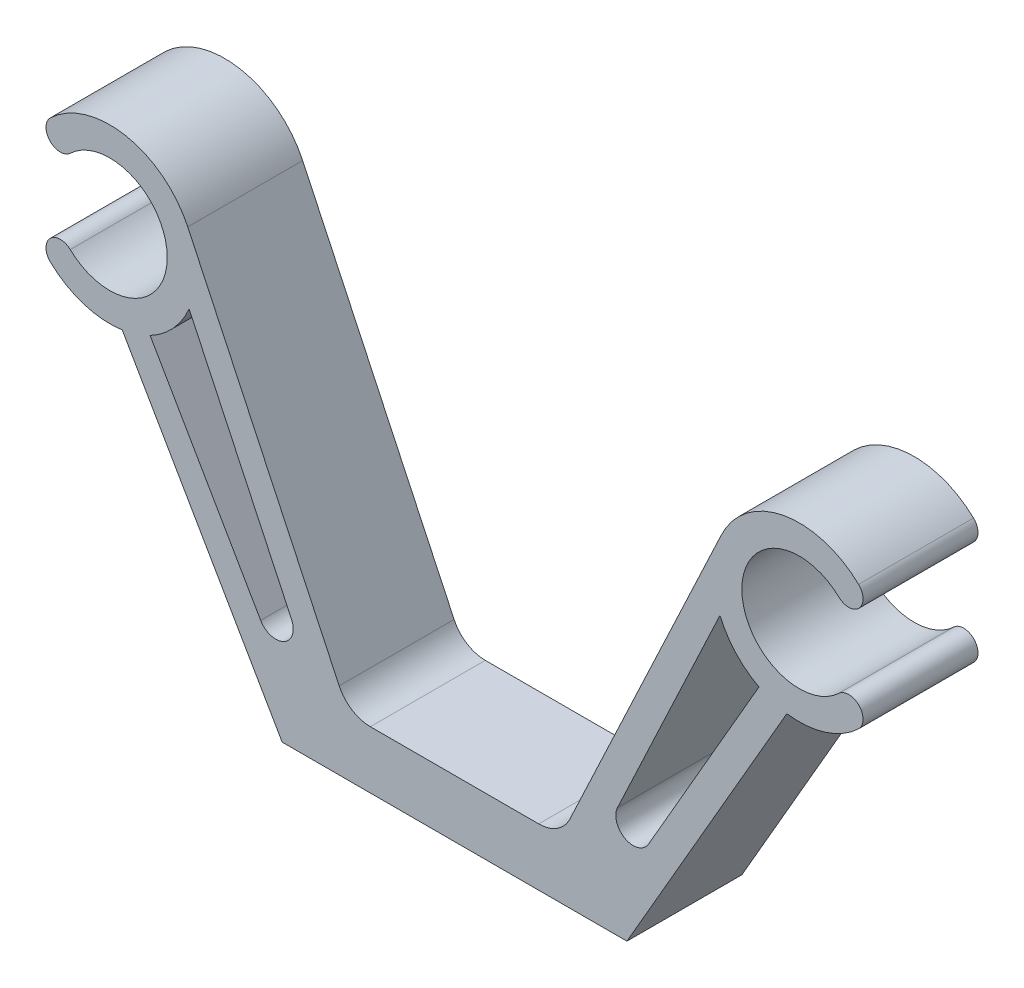
ISO-10303-21;
HEADER;
FILE_DESCRIPTION(('STEP AP214'),'2;1');
FILE_NAME('part.step','',(''),(''),'','','');
FILE_SCHEMA(('AUTOMOTIVE_DESIGN { 1 0 10303 214 1 1 1 1 }'));
ENDSEC;
DATA;
#1=APPLICATION_CONTEXT('core data for automotive mechanical design processes');
#2=APPLICATION_PROTOCOL_DEFINITION('international standard','automotive_design',2000,#1);
#3=PRODUCT_CONTEXT('',#1,'mechanical');
#4=PRODUCT('Part','Part','',(#3));
#5=PRODUCT_RELATED_PRODUCT_CATEGORY('part','',(#4));
#6=PRODUCT_DEFINITION_FORMATION('','',#4);
#7=PRODUCT_DEFINITION_CONTEXT('part definition',#1,'design');
#8=PRODUCT_DEFINITION('design','',#6,#7);
#9=PRODUCT_DEFINITION_SHAPE('','',#8);
#10=(LENGTH_UNIT() NAMED_UNIT(*) SI_UNIT(.MILLI.,.METRE.));
#11=(NAMED_UNIT(*) PLANE_ANGLE_UNIT() SI_UNIT($,.RADIAN.));
#12=(NAMED_UNIT(*) SI_UNIT($,.STERADIAN.) SOLID_ANGLE_UNIT());
#13=UNCERTAINTY_MEASURE_WITH_UNIT(LENGTH_MEASURE(1.E-05),#10,'distance_accuracy_value','');
#14=(GEOMETRIC_REPRESENTATION_CONTEXT(3) GLOBAL_UNCERTAINTY_ASSIGNED_CONTEXT((#13)) GLOBAL_UNIT_ASSIGNED_CONTEXT((#10,
#11,#12)) REPRESENTATION_CONTEXT('',''));
#15=CARTESIAN_POINT('',(0.,0.,0.));
#16=DIRECTION('',(0.,0.,1.));
#17=DIRECTION('',(1.,0.,0.));
#18=AXIS2_PLACEMENT_3D('',#15,#16,#17);
#19=CARTESIAN_POINT('',(-12.5,0.,0.));
#20=DIRECTION('',(0.,1.,0.));
#21=DIRECTION('',(1.,0.,0.));
#22=AXIS2_PLACEMENT_3D('',#19,#20,#21);
#23=CYLINDRICAL_SURFACE('',#22,1.25);
#24=CARTESIAN_POINT('',(-12.5,0.,0.));
#25=DIRECTION('',(0.,1.,0.));
#26=DIRECTION('',(1.,0.,0.));
#27=AXIS2_PLACEMENT_3D('',#24,#25,#26);
#28=CIRCLE('',#27,1.25);
#29=CARTESIAN_POINT('',(-11.25,0.,0.));
#30=VERTEX_POINT('',#29);
#31=CARTESIAN_POINT('',(-13.75,0.,0.));
#32=VERTEX_POINT('',#31);
#33=EDGE_CURVE('E41',#30,#32,#28,.T.);
#34=ORIENTED_EDGE('',*,*,#33,.F.);
#35=CARTESIAN_POINT('',(-12.5,0.,0.));
#36=DIRECTION('',(0.,1.,0.));
#37=DIRECTION('',(1.,0.,0.));
#38=AXIS2_PLACEMENT_3D('',#35,#36,#37);
#39=CIRCLE('',#38,1.25);
#40=EDGE_CURVE('E365',#32,#30,#39,.T.);
#41=ORIENTED_EDGE('',*,*,#40,.F.);
#42=DIRECTION('',(0.,1.,0.));
#43=VECTOR('',#42,1.);
#44=CARTESIAN_POINT('',(-13.75,0.,0.));
#45=LINE('',#44,#43);
#46=CARTESIAN_POINT('',(-13.75,4.5,0.));
#47=VERTEX_POINT('',#46);
#48=EDGE_CURVE('E11',#32,#47,#45,.T.);
#49=ORIENTED_EDGE('',*,*,#48,.T.);
#50=CARTESIAN_POINT('',(-12.5,4.5,0.));
#51=DIRECTION('',(0.,1.,0.));
#52=DIRECTION('',(1.,0.,0.));
#53=AXIS2_PLACEMENT_3D('',#50,#51,#52);
#54=CIRCLE('',#53,1.25);
#55=CARTESIAN_POINT('',(-11.25,4.5,0.));
#56=VERTEX_POINT('',#55);
#57=EDGE_CURVE('E27',#47,#56,#54,.T.);
#58=ORIENTED_EDGE('',*,*,#57,.T.);
#59=CARTESIAN_POINT('',(-12.5,4.5,0.));
#60=DIRECTION('',(0.,1.,0.));
#61=DIRECTION('',(1.,0.,0.));
#62=AXIS2_PLACEMENT_3D('',#59,#60,#61);
#63=CIRCLE('',#62,1.25);
#64=EDGE_CURVE('E323',#56,#47,#63,.T.);
#65=ORIENTED_EDGE('',*,*,#64,.T.);
#66=ORIENTED_EDGE('',*,*,#48,.F.);
#67=EDGE_LOOP('',(#34,#41,#49,#58,#65,#66));
#68=FACE_BOUND('',#67,.T.);
#69=ADVANCED_FACE('F16',(#68),#23,.F.);
#70=CARTESIAN_POINT('',(-12.5,4.5,0.));
#71=DIRECTION('',(0.,-1.,0.));
#72=DIRECTION('',(0.,0.,-1.));
#73=AXIS2_PLACEMENT_3D('',#70,#71,#72);
#74=PLANE('',#73);
#75=ORIENTED_EDGE('',*,*,#64,.F.);
#76=ORIENTED_EDGE('',*,*,#57,.F.);
#77=EDGE_LOOP('',(#75,#76));
#78=FACE_BOUND('',#77,.T.);
#79=ADVANCED_FACE('F632',(#78),#74,.T.);
#80=CARTESIAN_POINT('',(12.5,0.,0.));
#81=DIRECTION('',(0.,1.,0.));
#82=DIRECTION('',(1.,0.,0.));
#83=AXIS2_PLACEMENT_3D('',#80,#81,#82);
#84=CYLINDRICAL_SURFACE('',#83,1.25);
#85=CARTESIAN_POINT('',(12.5,0.,0.));
#86=DIRECTION('',(0.,1.,0.));
#87=DIRECTION('',(1.,0.,0.));
#88=AXIS2_PLACEMENT_3D('',#85,#86,#87);
#89=CIRCLE('',#88,1.25);
#90=CARTESIAN_POINT('',(13.75,0.,0.));
#91=VERTEX_POINT('',#90);
#92=CARTESIAN_POINT('',(11.25,0.,0.));
#93=VERTEX_POINT('',#92);
#94=EDGE_CURVE('E164',#91,#93,#89,.T.);
#95=ORIENTED_EDGE('',*,*,#94,.F.);
#96=CARTESIAN_POINT('',(12.5,0.,0.));
#97=DIRECTION('',(0.,1.,0.));
#98=DIRECTION('',(1.,0.,0.));
#99=AXIS2_PLACEMENT_3D('',#96,#97,#98);
#100=CIRCLE('',#99,1.25);
#101=EDGE_CURVE('E157',#93,#91,#100,.T.);
#102=ORIENTED_EDGE('',*,*,#101,.F.);
#103=DIRECTION('',(0.,1.,0.));
#104=VECTOR('',#103,1.);
#105=CARTESIAN_POINT('',(11.25,0.,0.));
#106=LINE('',#105,#104);
#107=CARTESIAN_POINT('',(11.25,4.5,0.));
#108=VERTEX_POINT('',#107);
#109=EDGE_CURVE('E219',#93,#108,#106,.T.);
#110=ORIENTED_EDGE('',*,*,#109,.T.);
#111=CARTESIAN_POINT('',(12.5,4.5,0.));
#112=DIRECTION('',(0.,1.,0.));
#113=DIRECTION('',(1.,0.,0.));
#114=AXIS2_PLACEMENT_3D('',#111,#112,#113);
#115=CIRCLE('',#114,1.25);
#116=CARTESIAN_POINT('',(13.75,4.5,0.));
#117=VERTEX_POINT('',#116);
#118=EDGE_CURVE('E215',#108,#117,#115,.T.);
#119=ORIENTED_EDGE('',*,*,#118,.T.);
#120=CARTESIAN_POINT('',(12.5,4.5,0.));
#121=DIRECTION('',(0.,1.,0.));
#122=DIRECTION('',(1.,0.,0.));
#123=AXIS2_PLACEMENT_3D('',#120,#121,#122);
#124=CIRCLE('',#123,1.25);
#125=EDGE_CURVE('E220',#117,#108,#124,.T.);
#126=ORIENTED_EDGE('',*,*,#125,.T.);
#127=ORIENTED_EDGE('',*,*,#109,.F.);
#128=EDGE_LOOP('',(#95,#102,#110,#119,#126,#127));
#129=FACE_BOUND('',#128,.T.);
#130=ADVANCED_FACE('F638',(#129),#84,.F.);
#131=CARTESIAN_POINT('',(12.5,4.5,0.));
#132=DIRECTION('',(0.,-1.,0.));
#133=DIRECTION('',(0.,0.,-1.));
#134=AXIS2_PLACEMENT_3D('',#131,#132,#133);
#135=PLANE('',#134);
#136=ORIENTED_EDGE('',*,*,#125,.F.);
#137=ORIENTED_EDGE('',*,*,#118,.F.);
#138=EDGE_LOOP('',(#136,#137));
#139=FACE_BOUND('',#138,.T.);
#140=ADVANCED_FACE('F640',(#139),#135,.T.);
#141=CARTESIAN_POINT('',(0.,19.5124133674503,-5.));
#142=DIRECTION('',(0.,0.,1.));
#143=DIRECTION('',(1.,0.,0.));
#144=AXIS2_PLACEMENT_3D('',#141,#142,#143);
#145=PLANE('',#144);
#146=CARTESIAN_POINT('',(34.2992907802256,36.0611907841218,-5.));
#147=DIRECTION('',(0.,0.,1.));
#148=DIRECTION('',(0.997274035322986,-0.0737868448343487,0.));
#149=AXIS2_PLACEMENT_3D('',#146,#147,#148);
#150=CIRCLE('',#149,1.25);
#151=CARTESIAN_POINT('',(33.4394326241805,35.1539179742776,-5.));
#152=VERTEX_POINT('',#151);
#153=CARTESIAN_POINT('',(35.1591489362707,36.9684635939661,-5.));
#154=VERTEX_POINT('',#153);
#155=EDGE_CURVE('E203',#152,#154,#150,.T.);
#156=ORIENTED_EDGE('',*,*,#155,.F.);
#157=CARTESIAN_POINT('',(30.,31.5248267349006,-5.));
#158=DIRECTION('',(0.,0.,1.));
#159=DIRECTION('',(-1.,0.,0.));
#160=AXIS2_PLACEMENT_3D('',#157,#158,#159);
#161=CIRCLE('',#160,5.);
#162=CARTESIAN_POINT('',(33.4394326241805,27.8957354955235,-5.));
#163=VERTEX_POINT('',#162);
#164=EDGE_CURVE('E412',#152,#163,#161,.T.);
#165=ORIENTED_EDGE('',*,*,#164,.T.);
#166=CARTESIAN_POINT('',(34.2992907802256,26.9884626856793,-5.));
#167=DIRECTION('',(0.,0.,1.));
#168=DIRECTION('',(0.997274035322986,0.0737868448343435,0.));
#169=AXIS2_PLACEMENT_3D('',#166,#167,#168);
#170=CIRCLE('',#169,1.25);
#171=CARTESIAN_POINT('',(35.1591489362707,26.081189875835,-5.));
#172=VERTEX_POINT('',#171);
#173=EDGE_CURVE('E311',#172,#163,#170,.T.);
#174=ORIENTED_EDGE('',*,*,#173,.F.);
#175=CARTESIAN_POINT('',(30.,31.5248267349006,-5.));
#176=DIRECTION('',(0.,0.,-1.));
#177=DIRECTION('',(-0.144507902995128,-0.989503646265111,0.));
#178=AXIS2_PLACEMENT_3D('',#175,#176,#177);
#179=CIRCLE('',#178,7.5);
#180=CARTESIAN_POINT('',(28.9161907275365,24.1035493879122,-5.));
#181=VERTEX_POINT('',#180);
#182=EDGE_CURVE('E173',#172,#181,#179,.T.);
#183=ORIENTED_EDGE('',*,*,#182,.T.);
#184=DIRECTION('',(-0.5,-0.866025403784439,0.));
#185=VECTOR('',#184,1.);
#186=CARTESIAN_POINT('',(15.,0.,-5.));
#187=LINE('',#186,#185);
#188=CARTESIAN_POINT('',(15.,0.,-5.));
#189=VERTEX_POINT('',#188);
#190=EDGE_CURVE('E145',#181,#189,#187,.T.);
#191=ORIENTED_EDGE('',*,*,#190,.T.);
#192=DIRECTION('',(-1.,0.,0.));
#193=VECTOR('',#192,1.);
#194=CARTESIAN_POINT('',(-15.,0.,-5.));
#195=LINE('',#194,#193);
#196=CARTESIAN_POINT('',(-15.,0.,-5.));
#197=VERTEX_POINT('',#196);
#198=EDGE_CURVE('E137',#189,#197,#195,.T.);
#199=ORIENTED_EDGE('',*,*,#198,.T.);
#200=DIRECTION('',(-0.5,0.866025403784439,0.));
#201=VECTOR('',#200,1.);
#202=CARTESIAN_POINT('',(-28.9161907275366,24.1035493879122,-5.));
#203=LINE('',#202,#201);
#204=CARTESIAN_POINT('',(-28.9161907275366,24.1035493879122,-5.));
#205=VERTEX_POINT('',#204);
#206=EDGE_CURVE('E126',#197,#205,#203,.T.);
#207=ORIENTED_EDGE('',*,*,#206,.T.);
#208=CARTESIAN_POINT('',(-30.,31.5248267349006,-5.));
#209=DIRECTION('',(0.,0.,-1.));
#210=DIRECTION('',(0.904791980801381,0.425853814680007,0.));
#211=AXIS2_PLACEMENT_3D('',#208,#209,#210);
#212=CIRCLE('',#211,7.5);
#213=CARTESIAN_POINT('',(-35.1591489362707,26.081189875835,-5.));
#214=VERTEX_POINT('',#213);
#215=EDGE_CURVE('E138',#205,#214,#212,.T.);
#216=ORIENTED_EDGE('',*,*,#215,.T.);
#217=CARTESIAN_POINT('',(-34.2992907802256,26.9884626856793,-5.));
#218=DIRECTION('',(0.,0.,1.));
#219=DIRECTION('',(-0.997274035322986,0.0737868448343487,0.));
#220=AXIS2_PLACEMENT_3D('',#217,#218,#219);
#221=CIRCLE('',#220,1.25);
#222=CARTESIAN_POINT('',(-33.4394326241805,27.8957354955235,-5.));
#223=VERTEX_POINT('',#222);
#224=EDGE_CURVE('E368',#223,#214,#221,.T.);
#225=ORIENTED_EDGE('',*,*,#224,.F.);
#226=CARTESIAN_POINT('',(-30.,31.5248267349006,-5.));
#227=DIRECTION('',(0.,0.,1.));
#228=DIRECTION('',(-1.,0.,0.));
#229=AXIS2_PLACEMENT_3D('',#226,#227,#228);
#230=CIRCLE('',#229,5.);
#231=CARTESIAN_POINT('',(-33.4394326241805,35.1539179742776,-5.));
#232=VERTEX_POINT('',#231);
#233=EDGE_CURVE('E294',#223,#232,#230,.T.);
#234=ORIENTED_EDGE('',*,*,#233,.T.);
#235=CARTESIAN_POINT('',(-34.2992907802256,36.0611907841218,-5.));
#236=DIRECTION('',(0.,0.,1.));
#237=DIRECTION('',(-0.997274035322986,-0.0737868448343487,0.));
#238=AXIS2_PLACEMENT_3D('',#235,#236,#237);
#239=CIRCLE('',#238,1.25);
#240=CARTESIAN_POINT('',(-35.1591489362707,36.9684635939661,-5.));
#241=VERTEX_POINT('',#240);
#242=EDGE_CURVE('E209',#241,#232,#239,.T.);
#243=ORIENTED_EDGE('',*,*,#242,.F.);
#244=CARTESIAN_POINT('',(-30.,31.5248267349006,-5.));
#245=DIRECTION('',(0.,0.,-1.));
#246=DIRECTION('',(0.904791980801381,0.425853814680007,0.));
#247=AXIS2_PLACEMENT_3D('',#244,#245,#246);
#248=CIRCLE('',#247,7.5);
#249=CARTESIAN_POINT('',(-23.2140601439896,34.7187303450006,-5.));
#250=VERTEX_POINT('',#249);
#251=EDGE_CURVE('E298',#241,#250,#248,.T.);
#252=ORIENTED_EDGE('',*,*,#251,.T.);
#253=DIRECTION('',(0.425853814680007,-0.904791980801381,0.));
#254=VECTOR('',#253,1.);
#255=CARTESIAN_POINT('',(-9.22649730810374,5.,-5.));
#256=LINE('',#255,#254);
#257=CARTESIAN_POINT('',(-10.0371886550339,6.72243855595998,-5.));
#258=VERTEX_POINT('',#257);
#259=EDGE_CURVE('E302',#250,#258,#256,.T.);
#260=ORIENTED_EDGE('',*,*,#259,.T.);
#261=CARTESIAN_POINT('',(-7.32281271262976,8.,-5.));
#262=DIRECTION('',(0.,0.,-1.));
#263=DIRECTION('',(-0.535792023699492,-0.844349991022682,0.));
#264=AXIS2_PLACEMENT_3D('',#261,#262,#263);
#265=CIRCLE('',#264,3.);
#266=CARTESIAN_POINT('',(-7.32281271262976,5.,-5.));
#267=VERTEX_POINT('',#266);
#268=EDGE_CURVE('E268',#267,#258,#265,.T.);
#269=ORIENTED_EDGE('',*,*,#268,.F.);
#270=DIRECTION('',(1.,0.,0.));
#271=VECTOR('',#270,1.);
#272=CARTESIAN_POINT('',(9.22649730810374,5.,-5.));
#273=LINE('',#272,#271);
#274=CARTESIAN_POINT('',(7.32281271262976,5.,-5.));
#275=VERTEX_POINT('',#274);
#276=EDGE_CURVE('E293',#267,#275,#273,.T.);
#277=ORIENTED_EDGE('',*,*,#276,.T.);
#278=CARTESIAN_POINT('',(7.32281271262976,8.,-5.));
#279=DIRECTION('',(0.,0.,-1.));
#280=DIRECTION('',(0.535792023699491,-0.844349991022682,0.));
#281=AXIS2_PLACEMENT_3D('',#278,#279,#280);
#282=CIRCLE('',#281,3.);
#283=CARTESIAN_POINT('',(10.0371886550339,6.72243855595998,-5.));
#284=VERTEX_POINT('',#283);
#285=EDGE_CURVE('E190',#284,#275,#282,.T.);
#286=ORIENTED_EDGE('',*,*,#285,.F.);
#287=DIRECTION('',(0.425853814680007,0.904791980801381,0.));
#288=VECTOR('',#287,1.);
#289=CARTESIAN_POINT('',(23.2140601439896,34.7187303450006,-5.));
#290=LINE('',#289,#288);
#291=CARTESIAN_POINT('',(23.2140601439896,34.7187303450006,-5.));
#292=VERTEX_POINT('',#291);
#293=EDGE_CURVE('E289',#284,#292,#290,.T.);
#294=ORIENTED_EDGE('',*,*,#293,.T.);
#295=CARTESIAN_POINT('',(30.,31.5248267349006,-5.));
#296=DIRECTION('',(0.,0.,-1.));
#297=DIRECTION('',(-0.144507902995128,-0.989503646265111,0.));
#298=AXIS2_PLACEMENT_3D('',#295,#296,#297);
#299=CIRCLE('',#298,7.5);
#300=EDGE_CURVE('E225',#292,#154,#299,.T.);
#301=ORIENTED_EDGE('',*,*,#300,.T.);
#302=EDGE_LOOP('',(#156,#165,#174,#183,#191,#199,#207,#216,#225,#234,#243,#252,#260,#269,#277,
#286,#294,#301));
#303=FACE_BOUND('',#302,.T.);
#304=DIRECTION('',(0.5,0.866025403784439,0.));
#305=VECTOR('',#304,1.);
#306=CARTESIAN_POINT('',(17.2022036638368,8.81432863437965,-5.));
#307=LINE('',#306,#305);
#308=CARTESIAN_POINT('',(16.8703480044572,8.23953777155488,-5.));
#309=VERTEX_POINT('',#308);
#310=CARTESIAN_POINT('',(26.4880544227988,24.8978939404038,-5.));
#311=VERTEX_POINT('',#310);
#312=EDGE_CURVE('E221',#309,#311,#307,.T.);
#313=ORIENTED_EDGE('',*,*,#312,.T.);
#314=CARTESIAN_POINT('',(30.,31.5248267349006,-5.));
#315=DIRECTION('',(0.,0.,-1.));
#316=DIRECTION('',(0.468259410293499,0.883591039266235,0.));
#317=AXIS2_PLACEMENT_3D('',#314,#315,#316);
#318=CIRCLE('',#317,7.5);
#319=CARTESIAN_POINT('',(23.0954449007379,28.5961548718792,-5.));
#320=VERTEX_POINT('',#319);
#321=EDGE_CURVE('E226',#311,#320,#318,.T.);
#322=ORIENTED_EDGE('',*,*,#321,.T.);
#323=DIRECTION('',(-0.425853814680007,-0.904791980801381,0.));
#324=VECTOR('',#323,1.);
#325=CARTESIAN_POINT('',(19.2512242352833,20.4285163287142,-5.));
#326=LINE('',#325,#324);
#327=CARTESIAN_POINT('',(14.1770685355542,9.64769148180683,-5.));
#328=VERTEX_POINT('',#327);
#329=EDGE_CURVE('E195',#320,#328,#326,.T.);
#330=ORIENTED_EDGE('',*,*,#329,.T.);
#331=CARTESIAN_POINT('',(15.5531887875532,9.,-5.));
#332=DIRECTION('',(0.,0.,1.));
#333=DIRECTION('',(0.866025403784439,-0.5,0.));
#334=AXIS2_PLACEMENT_3D('',#331,#332,#333);
#335=CIRCLE('',#334,1.52092445689024);
#336=EDGE_CURVE('E191',#328,#309,#335,.T.);
#337=ORIENTED_EDGE('',*,*,#336,.T.);
#338=EDGE_LOOP('',(#313,#322,#330,#337));
#339=FACE_BOUND('',#338,.T.);
#340=DIRECTION('',(-0.425853814680007,0.904791980801381,0.));
#341=VECTOR('',#340,1.);
#342=CARTESIAN_POINT('',(-19.2512242352833,20.4285163287142,-5.));
#343=LINE('',#342,#341);
#344=CARTESIAN_POINT('',(-14.1770685355542,9.64769148180683,-5.));
#345=VERTEX_POINT('',#344);
#346=CARTESIAN_POINT('',(-23.0954449007379,28.5961548718792,-5.));
#347=VERTEX_POINT('',#346);
#348=EDGE_CURVE('E196',#345,#347,#343,.T.);
#349=ORIENTED_EDGE('',*,*,#348,.T.);
#350=CARTESIAN_POINT('',(-30.,31.5248267349006,-5.));
#351=DIRECTION('',(0.,0.,-1.));
#352=DIRECTION('',(-0.468259410293499,0.883591039266235,0.));
#353=AXIS2_PLACEMENT_3D('',#350,#351,#352);
#354=CIRCLE('',#353,7.5);
#355=CARTESIAN_POINT('',(-26.4880544227988,24.8978939404038,-5.));
#356=VERTEX_POINT('',#355);
#357=EDGE_CURVE('E230',#347,#356,#354,.T.);
#358=ORIENTED_EDGE('',*,*,#357,.T.);
#359=DIRECTION('',(0.5,-0.866025403784439,0.));
#360=VECTOR('',#359,1.);
#361=CARTESIAN_POINT('',(-17.2022036638368,8.81432863437965,-5.));
#362=LINE('',#361,#360);
#363=CARTESIAN_POINT('',(-16.8703480044572,8.23953777155488,-5.));
#364=VERTEX_POINT('',#363);
#365=EDGE_CURVE('E243',#356,#364,#362,.T.);
#366=ORIENTED_EDGE('',*,*,#365,.T.);
#367=CARTESIAN_POINT('',(-15.5531887875532,9.,-5.));
#368=DIRECTION('',(0.,0.,1.));
#369=DIRECTION('',(-0.866025403784439,-0.5,0.));
#370=AXIS2_PLACEMENT_3D('',#367,#368,#369);
#371=CIRCLE('',#370,1.52092445689024);
#372=EDGE_CURVE('E281',#364,#345,#371,.T.);
#373=ORIENTED_EDGE('',*,*,#372,.T.);
#374=EDGE_LOOP('',(#349,#358,#366,#373));
#375=FACE_BOUND('',#374,.T.);
#376=ADVANCED_FACE('F141',(#303,#339,#375),#145,.F.);
#377=CARTESIAN_POINT('',(34.2992907802256,36.0611907841218,0.));
#378=DIRECTION('',(0.,0.,1.));
#379=DIRECTION('',(-0.0737868448343482,-0.997274035322986,0.));
#380=AXIS2_PLACEMENT_3D('',#377,#378,#379);
#381=CYLINDRICAL_SURFACE('',#380,1.25);
#382=CARTESIAN_POINT('',(34.2992907802256,36.0611907841218,5.));
#383=DIRECTION('',(0.,0.,-1.));
#384=DIRECTION('',(0.997274035322986,-0.0737868448343487,0.));
#385=AXIS2_PLACEMENT_3D('',#382,#383,#384);
#386=CIRCLE('',#385,1.25);
#387=CARTESIAN_POINT('',(35.1591489362707,36.9684635939661,5.));
#388=VERTEX_POINT('',#387);
#389=CARTESIAN_POINT('',(33.4394326241805,35.1539179742776,5.));
#390=VERTEX_POINT('',#389);
#391=EDGE_CURVE('E285',#388,#390,#386,.T.);
#392=ORIENTED_EDGE('',*,*,#391,.T.);
#393=DIRECTION('',(0.,0.,-1.));
#394=VECTOR('',#393,1.);
#395=CARTESIAN_POINT('',(33.4394326241805,35.1539179742776,0.));
#396=LINE('',#395,#394);
#397=EDGE_CURVE('E207',#390,#152,#396,.T.);
#398=ORIENTED_EDGE('',*,*,#397,.T.);
#399=ORIENTED_EDGE('',*,*,#155,.T.);
#400=DIRECTION('',(0.,0.,1.));
#401=VECTOR('',#400,1.);
#402=CARTESIAN_POINT('',(35.1591489362707,36.9684635939661,0.));
#403=LINE('',#402,#401);
#404=EDGE_CURVE('E208',#154,#388,#403,.T.);
#405=ORIENTED_EDGE('',*,*,#404,.T.);
#406=EDGE_LOOP('',(#392,#398,#399,#405));
#407=FACE_BOUND('',#406,.T.);
#408=ADVANCED_FACE('F648',(#407),#381,.T.);
#409=CARTESIAN_POINT('',(30.,31.5248267349006,0.));
#410=DIRECTION('',(0.,0.,1.));
#411=DIRECTION('',(-1.,0.,0.));
#412=AXIS2_PLACEMENT_3D('',#409,#410,#411);
#413=CYLINDRICAL_SURFACE('',#412,5.);
#414=ORIENTED_EDGE('',*,*,#397,.F.);
#415=CARTESIAN_POINT('',(30.,31.5248267349006,5.));
#416=DIRECTION('',(0.,0.,-1.));
#417=DIRECTION('',(-1.,0.,0.));
#418=AXIS2_PLACEMENT_3D('',#415,#416,#417);
#419=CIRCLE('',#418,5.);
#420=CARTESIAN_POINT('',(33.4394326241805,27.8957354955235,5.));
#421=VERTEX_POINT('',#420);
#422=EDGE_CURVE('E179',#421,#390,#419,.T.);
#423=ORIENTED_EDGE('',*,*,#422,.F.);
#424=DIRECTION('',(0.,0.,1.));
#425=VECTOR('',#424,1.);
#426=CARTESIAN_POINT('',(33.4394326241805,27.8957354955235,0.));
#427=LINE('',#426,#425);
#428=EDGE_CURVE('E316',#163,#421,#427,.T.);
#429=ORIENTED_EDGE('',*,*,#428,.F.);
#430=ORIENTED_EDGE('',*,*,#164,.F.);
#431=EDGE_LOOP('',(#414,#423,#429,#430));
#432=FACE_BOUND('',#431,.T.);
#433=ADVANCED_FACE('F666',(#432),#413,.F.);
#434=CARTESIAN_POINT('',(0.,19.5124133674503,5.));
#435=DIRECTION('',(0.,0.,1.));
#436=DIRECTION('',(1.,0.,0.));
#437=AXIS2_PLACEMENT_3D('',#434,#435,#436);
#438=PLANE('',#437);
#439=ORIENTED_EDGE('',*,*,#391,.F.);
#440=CARTESIAN_POINT('',(30.,31.5248267349006,5.));
#441=DIRECTION('',(0.,0.,1.));
#442=DIRECTION('',(-0.144507902995128,-0.989503646265111,0.));
#443=AXIS2_PLACEMENT_3D('',#440,#441,#442);
#444=CIRCLE('',#443,7.5);
#445=CARTESIAN_POINT('',(23.2140601439896,34.7187303450006,5.));
#446=VERTEX_POINT('',#445);
#447=EDGE_CURVE('E201',#388,#446,#444,.T.);
#448=ORIENTED_EDGE('',*,*,#447,.T.);
#449=DIRECTION('',(-0.425853814680007,-0.904791980801381,0.));
#450=VECTOR('',#449,1.);
#451=CARTESIAN_POINT('',(23.2140601439896,34.7187303450006,5.));
#452=LINE('',#451,#450);
#453=CARTESIAN_POINT('',(10.0371886550339,6.72243855595998,5.));
#454=VERTEX_POINT('',#453);
#455=EDGE_CURVE('E197',#446,#454,#452,.T.);
#456=ORIENTED_EDGE('',*,*,#455,.T.);
#457=CARTESIAN_POINT('',(7.32281271262976,8.,5.));
#458=DIRECTION('',(0.,0.,1.));
#459=DIRECTION('',(0.535792023699491,-0.844349991022682,0.));
#460=AXIS2_PLACEMENT_3D('',#457,#458,#459);
#461=CIRCLE('',#460,3.);
#462=CARTESIAN_POINT('',(7.32281271262976,5.,5.));
#463=VERTEX_POINT('',#462);
#464=EDGE_CURVE('E267',#463,#454,#461,.T.);
#465=ORIENTED_EDGE('',*,*,#464,.F.);
#466=DIRECTION('',(-1.,0.,0.));
#467=VECTOR('',#466,1.);
#468=CARTESIAN_POINT('',(9.22649730810374,5.,5.));
#469=LINE('',#468,#467);
#470=CARTESIAN_POINT('',(-7.32281271262976,5.,5.));
#471=VERTEX_POINT('',#470);
#472=EDGE_CURVE('E202',#463,#471,#469,.T.);
#473=ORIENTED_EDGE('',*,*,#472,.T.);
#474=CARTESIAN_POINT('',(-7.32281271262976,8.,5.));
#475=DIRECTION('',(0.,0.,1.));
#476=DIRECTION('',(-0.535792023699492,-0.844349991022682,0.));
#477=AXIS2_PLACEMENT_3D('',#474,#475,#476);
#478=CIRCLE('',#477,3.);
#479=CARTESIAN_POINT('',(-10.0371886550339,6.72243855595998,5.));
#480=VERTEX_POINT('',#479);
#481=EDGE_CURVE('E359',#480,#471,#478,.T.);
#482=ORIENTED_EDGE('',*,*,#481,.F.);
#483=DIRECTION('',(-0.425853814680007,0.904791980801381,0.));
#484=VECTOR('',#483,1.);
#485=CARTESIAN_POINT('',(-9.22649730810374,5.,5.));
#486=LINE('',#485,#484);
#487=CARTESIAN_POINT('',(-23.2140601439896,34.7187303450006,5.));
#488=VERTEX_POINT('',#487);
#489=EDGE_CURVE('E231',#480,#488,#486,.T.);
#490=ORIENTED_EDGE('',*,*,#489,.T.);
#491=CARTESIAN_POINT('',(-30.,31.5248267349006,5.));
#492=DIRECTION('',(0.,0.,1.));
#493=DIRECTION('',(0.904791980801381,0.425853814680007,0.));
#494=AXIS2_PLACEMENT_3D('',#491,#492,#493);
#495=CIRCLE('',#494,7.5);
#496=CARTESIAN_POINT('',(-35.1591489362707,36.9684635939661,5.));
#497=VERTEX_POINT('',#496);
#498=EDGE_CURVE('E235',#488,#497,#495,.T.);
#499=ORIENTED_EDGE('',*,*,#498,.T.);
#500=CARTESIAN_POINT('',(-34.2992907802256,36.0611907841218,5.));
#501=DIRECTION('',(0.,0.,-1.));
#502=DIRECTION('',(0.0737868448343482,-0.997274035322986,0.));
#503=AXIS2_PLACEMENT_3D('',#500,#501,#502);
#504=CIRCLE('',#503,1.25);
#505=CARTESIAN_POINT('',(-33.4394326241805,35.1539179742776,5.));
#506=VERTEX_POINT('',#505);
#507=EDGE_CURVE('E246',#506,#497,#504,.T.);
#508=ORIENTED_EDGE('',*,*,#507,.F.);
#509=CARTESIAN_POINT('',(-30.,31.5248267349006,5.));
#510=DIRECTION('',(0.,0.,-1.));
#511=DIRECTION('',(-1.,0.,0.));
#512=AXIS2_PLACEMENT_3D('',#509,#510,#511);
#513=CIRCLE('',#512,5.);
#514=CARTESIAN_POINT('',(-33.4394326241805,27.8957354955235,5.));
#515=VERTEX_POINT('',#514);
#516=EDGE_CURVE('E402',#506,#515,#513,.T.);
#517=ORIENTED_EDGE('',*,*,#516,.T.);
#518=CARTESIAN_POINT('',(-34.2992907802256,26.9884626856793,5.));
#519=DIRECTION('',(0.,0.,-1.));
#520=DIRECTION('',(-0.997274035322986,0.0737868448343487,0.));
#521=AXIS2_PLACEMENT_3D('',#518,#519,#520);
#522=CIRCLE('',#521,1.25);
#523=CARTESIAN_POINT('',(-35.1591489362707,26.081189875835,5.));
#524=VERTEX_POINT('',#523);
#525=EDGE_CURVE('E379',#524,#515,#522,.T.);
#526=ORIENTED_EDGE('',*,*,#525,.F.);
#527=CARTESIAN_POINT('',(-30.,31.5248267349006,5.));
#528=DIRECTION('',(0.,0.,1.));
#529=DIRECTION('',(0.904791980801381,0.425853814680007,0.));
#530=AXIS2_PLACEMENT_3D('',#527,#528,#529);
#531=CIRCLE('',#530,7.5);
#532=CARTESIAN_POINT('',(-28.9161907275366,24.1035493879122,5.));
#533=VERTEX_POINT('',#532);
#534=EDGE_CURVE('E339',#524,#533,#531,.T.);
#535=ORIENTED_EDGE('',*,*,#534,.T.);
#536=DIRECTION('',(0.5,-0.866025403784439,0.));
#537=VECTOR('',#536,1.);
#538=CARTESIAN_POINT('',(-28.9161907275366,24.1035493879122,5.));
#539=LINE('',#538,#537);
#540=CARTESIAN_POINT('',(-15.,0.,5.));
#541=VERTEX_POINT('',#540);
#542=EDGE_CURVE('E280',#533,#541,#539,.T.);
#543=ORIENTED_EDGE('',*,*,#542,.T.);
#544=DIRECTION('',(1.,0.,0.));
#545=VECTOR('',#544,1.);
#546=CARTESIAN_POINT('',(-15.,0.,5.));
#547=LINE('',#546,#545);
#548=CARTESIAN_POINT('',(15.,0.,5.));
#549=VERTEX_POINT('',#548);
#550=EDGE_CURVE('E154',#541,#549,#547,.T.);
#551=ORIENTED_EDGE('',*,*,#550,.T.);
#552=DIRECTION('',(0.5,0.866025403784439,0.));
#553=VECTOR('',#552,1.);
#554=CARTESIAN_POINT('',(15.,0.,5.));
#555=LINE('',#554,#553);
#556=CARTESIAN_POINT('',(28.9161907275365,24.1035493879122,5.));
#557=VERTEX_POINT('',#556);
#558=EDGE_CURVE('E178',#549,#557,#555,.T.);
#559=ORIENTED_EDGE('',*,*,#558,.T.);
#560=CARTESIAN_POINT('',(30.,31.5248267349006,5.));
#561=DIRECTION('',(0.,0.,1.));
#562=DIRECTION('',(-0.144507902995128,-0.989503646265111,0.));
#563=AXIS2_PLACEMENT_3D('',#560,#561,#562);
#564=CIRCLE('',#563,7.5);
#565=CARTESIAN_POINT('',(35.1591489362707,26.081189875835,5.));
#566=VERTEX_POINT('',#565);
#567=EDGE_CURVE('E174',#557,#566,#564,.T.);
#568=ORIENTED_EDGE('',*,*,#567,.T.);
#569=CARTESIAN_POINT('',(34.2992907802256,26.9884626856793,5.));
#570=DIRECTION('',(0.,0.,-1.));
#571=DIRECTION('',(-0.0737868448343482,0.997274035322986,0.));
#572=AXIS2_PLACEMENT_3D('',#569,#570,#571);
#573=CIRCLE('',#572,1.25);
#574=EDGE_CURVE('E256',#421,#566,#573,.T.);
#575=ORIENTED_EDGE('',*,*,#574,.F.);
#576=ORIENTED_EDGE('',*,*,#422,.T.);
#577=EDGE_LOOP('',(#439,#448,#456,#465,#473,#482,#490,#499,#508,#517,#526,#535,#543,#551,#559,
#568,#575,#576));
#578=FACE_BOUND('',#577,.T.);
#579=DIRECTION('',(0.425853814680007,-0.904791980801381,0.));
#580=VECTOR('',#579,1.);
#581=CARTESIAN_POINT('',(-19.2512242352833,20.4285163287142,5.));
#582=LINE('',#581,#580);
#583=CARTESIAN_POINT('',(-23.0954449007379,28.5961548718792,5.));
#584=VERTEX_POINT('',#583);
#585=CARTESIAN_POINT('',(-14.1770685355542,9.64769148180683,5.));
#586=VERTEX_POINT('',#585);
#587=EDGE_CURVE('E184',#584,#586,#582,.T.);
#588=ORIENTED_EDGE('',*,*,#587,.T.);
#589=CARTESIAN_POINT('',(-15.5531887875532,9.,5.));
#590=DIRECTION('',(0.,0.,-1.));
#591=DIRECTION('',(-0.866025403784439,-0.5,0.));
#592=AXIS2_PLACEMENT_3D('',#589,#590,#591);
#593=CIRCLE('',#592,1.52092445689024);
#594=CARTESIAN_POINT('',(-16.8703480044572,8.23953777155488,5.));
#595=VERTEX_POINT('',#594);
#596=EDGE_CURVE('E180',#586,#595,#593,.T.);
#597=ORIENTED_EDGE('',*,*,#596,.T.);
#598=DIRECTION('',(-0.5,0.866025403784439,0.));
#599=VECTOR('',#598,1.);
#600=CARTESIAN_POINT('',(-17.2022036638368,8.81432863437965,5.));
#601=LINE('',#600,#599);
#602=CARTESIAN_POINT('',(-26.4880544227988,24.8978939404038,5.));
#603=VERTEX_POINT('',#602);
#604=EDGE_CURVE('E20',#595,#603,#601,.T.);
#605=ORIENTED_EDGE('',*,*,#604,.T.);
#606=CARTESIAN_POINT('',(-30.,31.5248267349006,5.));
#607=DIRECTION('',(0.,0.,1.));
#608=DIRECTION('',(-0.468259410293499,0.883591039266235,0.));
#609=AXIS2_PLACEMENT_3D('',#606,#607,#608);
#610=CIRCLE('',#609,7.5);
#611=EDGE_CURVE('E307',#603,#584,#610,.T.);
#612=ORIENTED_EDGE('',*,*,#611,.T.);
#613=EDGE_LOOP('',(#588,#597,#605,#612));
#614=FACE_BOUND('',#613,.T.);
#615=DIRECTION('',(-0.5,-0.866025403784439,0.));
#616=VECTOR('',#615,1.);
#617=CARTESIAN_POINT('',(17.2022036638368,8.81432863437965,5.));
#618=LINE('',#617,#616);
#619=CARTESIAN_POINT('',(26.4880544227988,24.8978939404038,5.));
#620=VERTEX_POINT('',#619);
#621=CARTESIAN_POINT('',(16.8703480044572,8.23953777155488,5.));
#622=VERTEX_POINT('',#621);
#623=EDGE_CURVE('E303',#620,#622,#618,.T.);
#624=ORIENTED_EDGE('',*,*,#623,.T.);
#625=CARTESIAN_POINT('',(15.5531887875532,9.,5.));
#626=DIRECTION('',(0.,0.,-1.));
#627=DIRECTION('',(0.866025403784439,-0.5,0.));
#628=AXIS2_PLACEMENT_3D('',#625,#626,#627);
#629=CIRCLE('',#628,1.52092445689024);
#630=CARTESIAN_POINT('',(14.1770685355542,9.64769148180683,5.));
#631=VERTEX_POINT('',#630);
#632=EDGE_CURVE('E308',#622,#631,#629,.T.);
#633=ORIENTED_EDGE('',*,*,#632,.T.);
#634=DIRECTION('',(0.425853814680007,0.904791980801381,0.));
#635=VECTOR('',#634,1.);
#636=CARTESIAN_POINT('',(19.2512242352833,20.4285163287142,5.));
#637=LINE('',#636,#635);
#638=CARTESIAN_POINT('',(23.0954449007379,28.5961548718792,5.));
#639=VERTEX_POINT('',#638);
#640=EDGE_CURVE('E170',#631,#639,#637,.T.);
#641=ORIENTED_EDGE('',*,*,#640,.T.);
#642=CARTESIAN_POINT('',(30.,31.5248267349006,5.));
#643=DIRECTION('',(0.,0.,1.));
#644=DIRECTION('',(0.468259410293499,0.883591039266235,0.));
#645=AXIS2_PLACEMENT_3D('',#642,#643,#644);
#646=CIRCLE('',#645,7.5);
#647=EDGE_CURVE('E315',#639,#620,#646,.T.);
#648=ORIENTED_EDGE('',*,*,#647,.T.);
#649=EDGE_LOOP('',(#624,#633,#641,#648));
#650=FACE_BOUND('',#649,.T.);
#651=ADVANCED_FACE('F489',(#578,#614,#650),#438,.T.);
#652=CARTESIAN_POINT('',(34.2992907802256,26.9884626856793,0.));
#653=DIRECTION('',(0.,0.,-1.));
#654=DIRECTION('',(-0.0737868448343482,0.997274035322986,0.));
#655=AXIS2_PLACEMENT_3D('',#652,#653,#654);
#656=CYLINDRICAL_SURFACE('',#655,1.25);
#657=ORIENTED_EDGE('',*,*,#173,.T.);
#658=ORIENTED_EDGE('',*,*,#428,.T.);
#659=ORIENTED_EDGE('',*,*,#574,.T.);
#660=DIRECTION('',(0.,0.,-1.));
#661=VECTOR('',#660,1.);
#662=CARTESIAN_POINT('',(35.1591489362707,26.081189875835,0.));
#663=LINE('',#662,#661);
#664=EDGE_CURVE('E239',#566,#172,#663,.T.);
#665=ORIENTED_EDGE('',*,*,#664,.T.);
#666=EDGE_LOOP('',(#657,#658,#659,#665));
#667=FACE_BOUND('',#666,.T.);
#668=ADVANCED_FACE('F665',(#667),#656,.T.);
#669=CARTESIAN_POINT('',(30.,31.5248267349006,0.));
#670=DIRECTION('',(0.,0.,1.));
#671=DIRECTION('',(-0.185085546443899,0.982722412737983,0.));
#672=AXIS2_PLACEMENT_3D('',#669,#670,#671);
#673=CYLINDRICAL_SURFACE('',#672,7.5);
#674=ORIENTED_EDGE('',*,*,#404,.F.);
#675=ORIENTED_EDGE('',*,*,#300,.F.);
#676=DIRECTION('',(0.,0.,1.));
#677=VECTOR('',#676,1.);
#678=CARTESIAN_POINT('',(23.2140601439896,34.7187303450006,0.));
#679=LINE('',#678,#677);
#680=EDGE_CURVE('E213',#292,#446,#679,.T.);
#681=ORIENTED_EDGE('',*,*,#680,.T.);
#682=ORIENTED_EDGE('',*,*,#447,.F.);
#683=EDGE_LOOP('',(#674,#675,#681,#682));
#684=FACE_BOUND('',#683,.T.);
#685=ADVANCED_FACE('F777',(#684),#673,.T.);
#686=CARTESIAN_POINT('',(-34.2992907802256,36.0611907841218,0.));
#687=DIRECTION('',(0.,0.,-1.));
#688=DIRECTION('',(0.0737868448343482,-0.997274035322986,0.));
#689=AXIS2_PLACEMENT_3D('',#686,#687,#688);
#690=CYLINDRICAL_SURFACE('',#689,1.25);
#691=ORIENTED_EDGE('',*,*,#242,.T.);
#692=DIRECTION('',(0.,0.,1.));
#693=VECTOR('',#692,1.);
#694=CARTESIAN_POINT('',(-33.4394326241805,35.1539179742776,0.));
#695=LINE('',#694,#693);
#696=EDGE_CURVE('E214',#232,#506,#695,.T.);
#697=ORIENTED_EDGE('',*,*,#696,.T.);
#698=ORIENTED_EDGE('',*,*,#507,.T.);
#699=DIRECTION('',(0.,0.,-1.));
#700=VECTOR('',#699,1.);
#701=CARTESIAN_POINT('',(-35.1591489362707,36.9684635939661,0.));
#702=LINE('',#701,#700);
#703=EDGE_CURVE('E443',#497,#241,#702,.T.);
#704=ORIENTED_EDGE('',*,*,#703,.T.);
#705=EDGE_LOOP('',(#691,#697,#698,#704));
#706=FACE_BOUND('',#705,.T.);
#707=ADVANCED_FACE('F18',(#706),#690,.T.);
#708=CARTESIAN_POINT('',(-34.2992907802256,26.9884626856793,0.));
#709=DIRECTION('',(0.,0.,1.));
#710=DIRECTION('',(0.0737868448343482,0.997274035322986,0.));
#711=AXIS2_PLACEMENT_3D('',#708,#709,#710);
#712=CYLINDRICAL_SURFACE('',#711,1.25);
#713=ORIENTED_EDGE('',*,*,#525,.T.);
#714=DIRECTION('',(0.,0.,-1.));
#715=VECTOR('',#714,1.);
#716=CARTESIAN_POINT('',(-33.4394326241805,27.8957354955235,0.));
#717=LINE('',#716,#715);
#718=EDGE_CURVE('E371',#515,#223,#717,.T.);
#719=ORIENTED_EDGE('',*,*,#718,.T.);
#720=ORIENTED_EDGE('',*,*,#224,.T.);
#721=DIRECTION('',(0.,0.,1.));
#722=VECTOR('',#721,1.);
#723=CARTESIAN_POINT('',(-35.1591489362707,26.081189875835,0.));
#724=LINE('',#723,#722);
#725=EDGE_CURVE('E349',#214,#524,#724,.T.);
#726=ORIENTED_EDGE('',*,*,#725,.T.);
#727=EDGE_LOOP('',(#713,#719,#720,#726));
#728=FACE_BOUND('',#727,.T.);
#729=ADVANCED_FACE('F499',(#728),#712,.T.);
#730=CARTESIAN_POINT('',(-30.,31.5248267349006,0.));
#731=DIRECTION('',(0.,0.,1.));
#732=DIRECTION('',(0.904791980801381,0.425853814680007,0.));
#733=AXIS2_PLACEMENT_3D('',#730,#731,#732);
#734=CYLINDRICAL_SURFACE('',#733,7.5);
#735=ORIENTED_EDGE('',*,*,#703,.F.);
#736=ORIENTED_EDGE('',*,*,#498,.F.);
#737=DIRECTION('',(0.,0.,1.));
#738=VECTOR('',#737,1.);
#739=CARTESIAN_POINT('',(-23.2140601439896,34.7187303450006,0.));
#740=LINE('',#739,#738);
#741=EDGE_CURVE('E269',#250,#488,#740,.T.);
#742=ORIENTED_EDGE('',*,*,#741,.F.);
#743=ORIENTED_EDGE('',*,*,#251,.F.);
#744=EDGE_LOOP('',(#735,#736,#742,#743));
#745=FACE_BOUND('',#744,.T.);
#746=ADVANCED_FACE('F670',(#745),#734,.T.);
#747=CARTESIAN_POINT('',(-30.,31.5248267349006,0.));
#748=DIRECTION('',(0.,0.,1.));
#749=DIRECTION('',(1.,0.,0.));
#750=AXIS2_PLACEMENT_3D('',#747,#748,#749);
#751=CYLINDRICAL_SURFACE('',#750,5.);
#752=ORIENTED_EDGE('',*,*,#696,.F.);
#753=ORIENTED_EDGE('',*,*,#233,.F.);
#754=ORIENTED_EDGE('',*,*,#718,.F.);
#755=ORIENTED_EDGE('',*,*,#516,.F.);
#756=EDGE_LOOP('',(#752,#753,#754,#755));
#757=FACE_BOUND('',#756,.T.);
#758=ADVANCED_FACE('F497',(#757),#751,.F.);
#759=CARTESIAN_POINT('',(16.8703480044572,8.23953777155488,5.));
#760=DIRECTION('',(-0.866025403784439,0.5,0.));
#761=DIRECTION('',(0.,0.,1.));
#762=AXIS2_PLACEMENT_3D('',#759,#760,#761);
#763=PLANE('',#762);
#764=ORIENTED_EDGE('',*,*,#312,.F.);
#765=DIRECTION('',(0.,0.,-1.));
#766=VECTOR('',#765,1.);
#767=CARTESIAN_POINT('',(16.8703480044572,8.23953777155488,5.));
#768=LINE('',#767,#766);
#769=EDGE_CURVE('E257',#622,#309,#768,.T.);
#770=ORIENTED_EDGE('',*,*,#769,.F.);
#771=ORIENTED_EDGE('',*,*,#623,.F.);
#772=DIRECTION('',(0.,0.,-1.));
#773=VECTOR('',#772,1.);
#774=CARTESIAN_POINT('',(26.4880544227988,24.8978939404038,5.));
#775=LINE('',#774,#773);
#776=EDGE_CURVE('E261',#620,#311,#775,.T.);
#777=ORIENTED_EDGE('',*,*,#776,.T.);
#778=EDGE_LOOP('',(#764,#770,#771,#777));
#779=FACE_BOUND('',#778,.T.);
#780=ADVANCED_FACE('F669',(#779),#763,.T.);
#781=CARTESIAN_POINT('',(15.5531887875532,9.,5.));
#782=DIRECTION('',(0.,0.,1.));
#783=DIRECTION('',(0.866025403784439,-0.5,0.));
#784=AXIS2_PLACEMENT_3D('',#781,#782,#783);
#785=CYLINDRICAL_SURFACE('',#784,1.52092445689024);
#786=ORIENTED_EDGE('',*,*,#336,.F.);
#787=DIRECTION('',(0.,0.,-1.));
#788=VECTOR('',#787,1.);
#789=CARTESIAN_POINT('',(14.1770685355542,9.64769148180683,5.));
#790=LINE('',#789,#788);
#791=EDGE_CURVE('E262',#631,#328,#790,.T.);
#792=ORIENTED_EDGE('',*,*,#791,.F.);
#793=ORIENTED_EDGE('',*,*,#632,.F.);
#794=ORIENTED_EDGE('',*,*,#769,.T.);
#795=EDGE_LOOP('',(#786,#792,#793,#794));
#796=FACE_BOUND('',#795,.T.);
#797=ADVANCED_FACE('F710',(#796),#785,.F.);
#798=CARTESIAN_POINT('',(23.0954449007379,28.5961548718792,5.));
#799=DIRECTION('',(0.904791980801381,-0.425853814680007,0.));
#800=DIRECTION('',(0.,0.,-1.));
#801=AXIS2_PLACEMENT_3D('',#798,#799,#800);
#802=PLANE('',#801);
#803=ORIENTED_EDGE('',*,*,#329,.F.);
#804=DIRECTION('',(0.,0.,-1.));
#805=VECTOR('',#804,1.);
#806=CARTESIAN_POINT('',(23.0954449007379,28.5961548718792,5.));
#807=LINE('',#806,#805);
#808=EDGE_CURVE('E433',#639,#320,#807,.T.);
#809=ORIENTED_EDGE('',*,*,#808,.F.);
#810=ORIENTED_EDGE('',*,*,#640,.F.);
#811=ORIENTED_EDGE('',*,*,#791,.T.);
#812=EDGE_LOOP('',(#803,#809,#810,#811));
#813=FACE_BOUND('',#812,.T.);
#814=ADVANCED_FACE('F707',(#813),#802,.T.);
#815=CARTESIAN_POINT('',(30.,31.5248267349006,5.));
#816=DIRECTION('',(0.,0.,1.));
#817=DIRECTION('',(0.468259410293499,0.883591039266235,0.));
#818=AXIS2_PLACEMENT_3D('',#815,#816,#817);
#819=CYLINDRICAL_SURFACE('',#818,7.5);
#820=ORIENTED_EDGE('',*,*,#321,.F.);
#821=ORIENTED_EDGE('',*,*,#776,.F.);
#822=ORIENTED_EDGE('',*,*,#647,.F.);
#823=ORIENTED_EDGE('',*,*,#808,.T.);
#824=EDGE_LOOP('',(#820,#821,#822,#823));
#825=FACE_BOUND('',#824,.T.);
#826=ADVANCED_FACE('F709',(#825),#819,.T.);
#827=CARTESIAN_POINT('',(-16.8703480044572,8.23953777155488,5.));
#828=DIRECTION('',(-0.866025403784439,-0.5,0.));
#829=DIRECTION('',(-0.5,0.866025403784439,0.));
#830=AXIS2_PLACEMENT_3D('',#827,#828,#829);
#831=PLANE('',#830);
#832=ORIENTED_EDGE('',*,*,#365,.F.);
#833=DIRECTION('',(0.,0.,-1.));
#834=VECTOR('',#833,1.);
#835=CARTESIAN_POINT('',(-26.4880544227988,24.8978939404038,5.));
#836=LINE('',#835,#834);
#837=EDGE_CURVE('E185',#603,#356,#836,.T.);
#838=ORIENTED_EDGE('',*,*,#837,.F.);
#839=ORIENTED_EDGE('',*,*,#604,.F.);
#840=DIRECTION('',(0.,0.,-1.));
#841=VECTOR('',#840,1.);
#842=CARTESIAN_POINT('',(-16.8703480044572,8.23953777155488,5.));
#843=LINE('',#842,#841);
#844=EDGE_CURVE('E252',#595,#364,#843,.T.);
#845=ORIENTED_EDGE('',*,*,#844,.T.);
#846=EDGE_LOOP('',(#832,#838,#839,#845));
#847=FACE_BOUND('',#846,.T.);
#848=ADVANCED_FACE('F684',(#847),#831,.F.);
#849=CARTESIAN_POINT('',(-15.5531887875532,9.,5.));
#850=DIRECTION('',(0.,0.,-1.));
#851=DIRECTION('',(-0.866025403784439,-0.5,0.));
#852=AXIS2_PLACEMENT_3D('',#849,#850,#851);
#853=CYLINDRICAL_SURFACE('',#852,1.52092445689024);
#854=ORIENTED_EDGE('',*,*,#372,.F.);
#855=ORIENTED_EDGE('',*,*,#844,.F.);
#856=ORIENTED_EDGE('',*,*,#596,.F.);
#857=DIRECTION('',(0.,0.,-1.));
#858=VECTOR('',#857,1.);
#859=CARTESIAN_POINT('',(-14.1770685355542,9.64769148180683,5.));
#860=LINE('',#859,#858);
#861=EDGE_CURVE('E248',#586,#345,#860,.T.);
#862=ORIENTED_EDGE('',*,*,#861,.T.);
#863=EDGE_LOOP('',(#854,#855,#856,#862));
#864=FACE_BOUND('',#863,.T.);
#865=ADVANCED_FACE('F675',(#864),#853,.F.);
#866=CARTESIAN_POINT('',(-23.0954449007379,28.5961548718792,5.));
#867=DIRECTION('',(0.904791980801381,0.425853814680007,0.));
#868=DIRECTION('',(0.,0.,-1.));
#869=AXIS2_PLACEMENT_3D('',#866,#867,#868);
#870=PLANE('',#869);
#871=ORIENTED_EDGE('',*,*,#348,.F.);
#872=ORIENTED_EDGE('',*,*,#861,.F.);
#873=ORIENTED_EDGE('',*,*,#587,.F.);
#874=DIRECTION('',(0.,0.,-1.));
#875=VECTOR('',#874,1.);
#876=CARTESIAN_POINT('',(-23.0954449007379,28.5961548718792,5.));
#877=LINE('',#876,#875);
#878=EDGE_CURVE('E189',#584,#347,#877,.T.);
#879=ORIENTED_EDGE('',*,*,#878,.T.);
#880=EDGE_LOOP('',(#871,#872,#873,#879));
#881=FACE_BOUND('',#880,.T.);
#882=ADVANCED_FACE('F671',(#881),#870,.F.);
#883=CARTESIAN_POINT('',(-30.,31.5248267349006,5.));
#884=DIRECTION('',(0.,0.,-1.));
#885=DIRECTION('',(-0.468259410293499,0.883591039266235,0.));
#886=AXIS2_PLACEMENT_3D('',#883,#884,#885);
#887=CYLINDRICAL_SURFACE('',#886,7.5);
#888=ORIENTED_EDGE('',*,*,#357,.F.);
#889=ORIENTED_EDGE('',*,*,#878,.F.);
#890=ORIENTED_EDGE('',*,*,#611,.F.);
#891=ORIENTED_EDGE('',*,*,#837,.T.);
#892=EDGE_LOOP('',(#888,#889,#890,#891));
#893=FACE_BOUND('',#892,.T.);
#894=ADVANCED_FACE('F674',(#893),#887,.T.);
#895=CARTESIAN_POINT('',(7.32281271262976,8.,0.));
#896=DIRECTION('',(0.,0.,1.));
#897=DIRECTION('',(0.535792023699491,-0.844349991022682,0.));
#898=AXIS2_PLACEMENT_3D('',#895,#896,#897);
#899=CYLINDRICAL_SURFACE('',#898,3.);
#900=ORIENTED_EDGE('',*,*,#285,.T.);
#901=DIRECTION('',(0.,0.,1.));
#902=VECTOR('',#901,1.);
#903=CARTESIAN_POINT('',(7.32281271262976,5.,0.));
#904=LINE('',#903,#902);
#905=EDGE_CURVE('E330',#275,#463,#904,.T.);
#906=ORIENTED_EDGE('',*,*,#905,.T.);
#907=ORIENTED_EDGE('',*,*,#464,.T.);
#908=DIRECTION('',(0.,0.,-1.));
#909=VECTOR('',#908,1.);
#910=CARTESIAN_POINT('',(10.0371886550339,6.72243855595998,0.));
#911=LINE('',#910,#909);
#912=EDGE_CURVE('E263',#454,#284,#911,.T.);
#913=ORIENTED_EDGE('',*,*,#912,.T.);
#914=EDGE_LOOP('',(#900,#906,#907,#913));
#915=FACE_BOUND('',#914,.T.);
#916=ADVANCED_FACE('F677',(#915),#899,.F.);
#917=CARTESIAN_POINT('',(9.22649730810374,5.,0.));
#918=DIRECTION('',(0.,1.,0.));
#919=DIRECTION('',(1.,0.,0.));
#920=AXIS2_PLACEMENT_3D('',#917,#918,#919);
#921=PLANE('',#920);
#922=ORIENTED_EDGE('',*,*,#905,.F.);
#923=ORIENTED_EDGE('',*,*,#276,.F.);
#924=DIRECTION('',(0.,0.,-1.));
#925=VECTOR('',#924,1.);
#926=CARTESIAN_POINT('',(-7.32281271262976,5.,0.));
#927=LINE('',#926,#925);
#928=EDGE_CURVE('E273',#471,#267,#927,.T.);
#929=ORIENTED_EDGE('',*,*,#928,.F.);
#930=ORIENTED_EDGE('',*,*,#472,.F.);
#931=EDGE_LOOP('',(#922,#923,#929,#930));
#932=FACE_BOUND('',#931,.T.);
#933=ADVANCED_FACE('F680',(#932),#921,.T.);
#934=CARTESIAN_POINT('',(-7.32281271262976,8.,0.));
#935=DIRECTION('',(0.,0.,1.));
#936=DIRECTION('',(-0.535792023699492,-0.844349991022682,0.));
#937=AXIS2_PLACEMENT_3D('',#934,#935,#936);
#938=CYLINDRICAL_SURFACE('',#937,3.);
#939=ORIENTED_EDGE('',*,*,#268,.T.);
#940=DIRECTION('',(0.,0.,1.));
#941=VECTOR('',#940,1.);
#942=CARTESIAN_POINT('',(-10.0371886550339,6.72243855595998,0.));
#943=LINE('',#942,#941);
#944=EDGE_CURVE('E395',#258,#480,#943,.T.);
#945=ORIENTED_EDGE('',*,*,#944,.T.);
#946=ORIENTED_EDGE('',*,*,#481,.T.);
#947=ORIENTED_EDGE('',*,*,#928,.T.);
#948=EDGE_LOOP('',(#939,#945,#946,#947));
#949=FACE_BOUND('',#948,.T.);
#950=ADVANCED_FACE('F688',(#949),#938,.F.);
#951=CARTESIAN_POINT('',(-9.22649730810374,5.,0.));
#952=DIRECTION('',(0.904791980801381,0.425853814680007,0.));
#953=DIRECTION('',(0.,0.,-1.));
#954=AXIS2_PLACEMENT_3D('',#951,#952,#953);
#955=PLANE('',#954);
#956=ORIENTED_EDGE('',*,*,#944,.F.);
#957=ORIENTED_EDGE('',*,*,#259,.F.);
#958=ORIENTED_EDGE('',*,*,#741,.T.);
#959=ORIENTED_EDGE('',*,*,#489,.F.);
#960=EDGE_LOOP('',(#956,#957,#958,#959));
#961=FACE_BOUND('',#960,.T.);
#962=ADVANCED_FACE('F660',(#961),#955,.T.);
#963=CARTESIAN_POINT('',(-30.,31.5248267349006,0.));
#964=DIRECTION('',(0.,0.,1.));
#965=DIRECTION('',(0.904791980801381,0.425853814680007,0.));
#966=AXIS2_PLACEMENT_3D('',#963,#964,#965);
#967=CYLINDRICAL_SURFACE('',#966,7.5);
#968=ORIENTED_EDGE('',*,*,#725,.F.);
#969=ORIENTED_EDGE('',*,*,#215,.F.);
#970=DIRECTION('',(0.,0.,-1.));
#971=VECTOR('',#970,1.);
#972=CARTESIAN_POINT('',(-28.9161907275366,24.1035493879122,0.));
#973=LINE('',#972,#971);
#974=EDGE_CURVE('E133',#533,#205,#973,.T.);
#975=ORIENTED_EDGE('',*,*,#974,.F.);
#976=ORIENTED_EDGE('',*,*,#534,.F.);
#977=EDGE_LOOP('',(#968,#969,#975,#976));
#978=FACE_BOUND('',#977,.T.);
#979=ADVANCED_FACE('F693',(#978),#967,.T.);
#980=CARTESIAN_POINT('',(23.2140601439896,34.7187303450006,0.));
#981=DIRECTION('',(-0.904791980801381,0.425853814680007,0.));
#982=DIRECTION('',(0.,0.,1.));
#983=AXIS2_PLACEMENT_3D('',#980,#981,#982);
#984=PLANE('',#983);
#985=ORIENTED_EDGE('',*,*,#912,.F.);
#986=ORIENTED_EDGE('',*,*,#455,.F.);
#987=ORIENTED_EDGE('',*,*,#680,.F.);
#988=ORIENTED_EDGE('',*,*,#293,.F.);
#989=EDGE_LOOP('',(#985,#986,#987,#988));
#990=FACE_BOUND('',#989,.T.);
#991=ADVANCED_FACE('F696',(#990),#984,.T.);
#992=CARTESIAN_POINT('',(30.,31.5248267349006,0.));
#993=DIRECTION('',(0.,0.,1.));
#994=DIRECTION('',(-0.144507902995128,-0.989503646265111,0.));
#995=AXIS2_PLACEMENT_3D('',#992,#993,#994);
#996=CYLINDRICAL_SURFACE('',#995,7.5);
#997=ORIENTED_EDGE('',*,*,#664,.F.);
#998=ORIENTED_EDGE('',*,*,#567,.F.);
#999=DIRECTION('',(0.,0.,1.));
#1000=VECTOR('',#999,1.);
#1001=CARTESIAN_POINT('',(28.9161907275365,24.1035493879122,0.));
#1002=LINE('',#1001,#1000);
#1003=EDGE_CURVE('E274',#181,#557,#1002,.T.);
#1004=ORIENTED_EDGE('',*,*,#1003,.F.);
#1005=ORIENTED_EDGE('',*,*,#182,.F.);
#1006=EDGE_LOOP('',(#997,#998,#1004,#1005));
#1007=FACE_BOUND('',#1006,.T.);
#1008=ADVANCED_FACE('F698',(#1007),#996,.T.);
#1009=CARTESIAN_POINT('',(15.,0.,0.));
#1010=DIRECTION('',(0.866025403784439,-0.5,0.));
#1011=DIRECTION('',(0.,0.,-1.));
#1012=AXIS2_PLACEMENT_3D('',#1009,#1010,#1011);
#1013=PLANE('',#1012);
#1014=ORIENTED_EDGE('',*,*,#1003,.T.);
#1015=ORIENTED_EDGE('',*,*,#558,.F.);
#1016=DIRECTION('',(0.,0.,1.));
#1017=VECTOR('',#1016,1.);
#1018=CARTESIAN_POINT('',(15.,0.,0.));
#1019=LINE('',#1018,#1017);
#1020=EDGE_CURVE('E275',#189,#549,#1019,.T.);
#1021=ORIENTED_EDGE('',*,*,#1020,.F.);
#1022=ORIENTED_EDGE('',*,*,#190,.F.);
#1023=EDGE_LOOP('',(#1014,#1015,#1021,#1022));
#1024=FACE_BOUND('',#1023,.T.);
#1025=ADVANCED_FACE('F635',(#1024),#1013,.T.);
#1026=CARTESIAN_POINT('',(-15.,0.,0.));
#1027=DIRECTION('',(0.,-1.,0.));
#1028=DIRECTION('',(0.,0.,-1.));
#1029=AXIS2_PLACEMENT_3D('',#1026,#1027,#1028);
#1030=PLANE('',#1029);
#1031=ORIENTED_EDGE('',*,*,#1020,.T.);
#1032=ORIENTED_EDGE('',*,*,#550,.F.);
#1033=DIRECTION('',(0.,0.,1.));
#1034=VECTOR('',#1033,1.);
#1035=CARTESIAN_POINT('',(-15.,0.,0.));
#1036=LINE('',#1035,#1034);
#1037=EDGE_CURVE('E131',#197,#541,#1036,.T.);
#1038=ORIENTED_EDGE('',*,*,#1037,.F.);
#1039=ORIENTED_EDGE('',*,*,#198,.F.);
#1040=EDGE_LOOP('',(#1031,#1032,#1038,#1039));
#1041=FACE_BOUND('',#1040,.T.);
#1042=ORIENTED_EDGE('',*,*,#33,.T.);
#1043=ORIENTED_EDGE('',*,*,#40,.T.);
#1044=EDGE_LOOP('',(#1042,#1043));
#1045=FACE_BOUND('',#1044,.T.);
#1046=ORIENTED_EDGE('',*,*,#94,.T.);
#1047=ORIENTED_EDGE('',*,*,#101,.T.);
#1048=EDGE_LOOP('',(#1046,#1047));
#1049=FACE_BOUND('',#1048,.T.);
#1050=ADVANCED_FACE('F151',(#1041,#1045,#1049),#1030,.T.);
#1051=CARTESIAN_POINT('',(-28.9161907275366,24.1035493879122,0.));
#1052=DIRECTION('',(-0.866025403784439,-0.5,0.));
#1053=DIRECTION('',(-0.5,0.866025403784439,0.));
#1054=AXIS2_PLACEMENT_3D('',#1051,#1052,#1053);
#1055=PLANE('',#1054);
#1056=ORIENTED_EDGE('',*,*,#1037,.T.);
#1057=ORIENTED_EDGE('',*,*,#542,.F.);
#1058=ORIENTED_EDGE('',*,*,#974,.T.);
#1059=ORIENTED_EDGE('',*,*,#206,.F.);
#1060=EDGE_LOOP('',(#1056,#1057,#1058,#1059));
#1061=FACE_BOUND('',#1060,.T.);
#1062=ADVANCED_FACE('F128',(#1061),#1055,.T.);
#1063=CLOSED_SHELL('',(#69,#79,#130,#140,#376,#408,#433,#651,#668,#685,#707,#729,#746,#758,#780,
#797,#814,#826,#848,#865,#882,#894,#916,#933,#950,#962,#979,#991,#1008,#1025,#1050,#1062));
#1064=MANIFOLD_SOLID_BREP('B1',#1063);
#1065=ADVANCED_BREP_SHAPE_REPRESENTATION('',(#18,#1064),#14);
#1066=SHAPE_DEFINITION_REPRESENTATION(#9,#1065);
ENDSEC;
END-ISO-10303-21;
